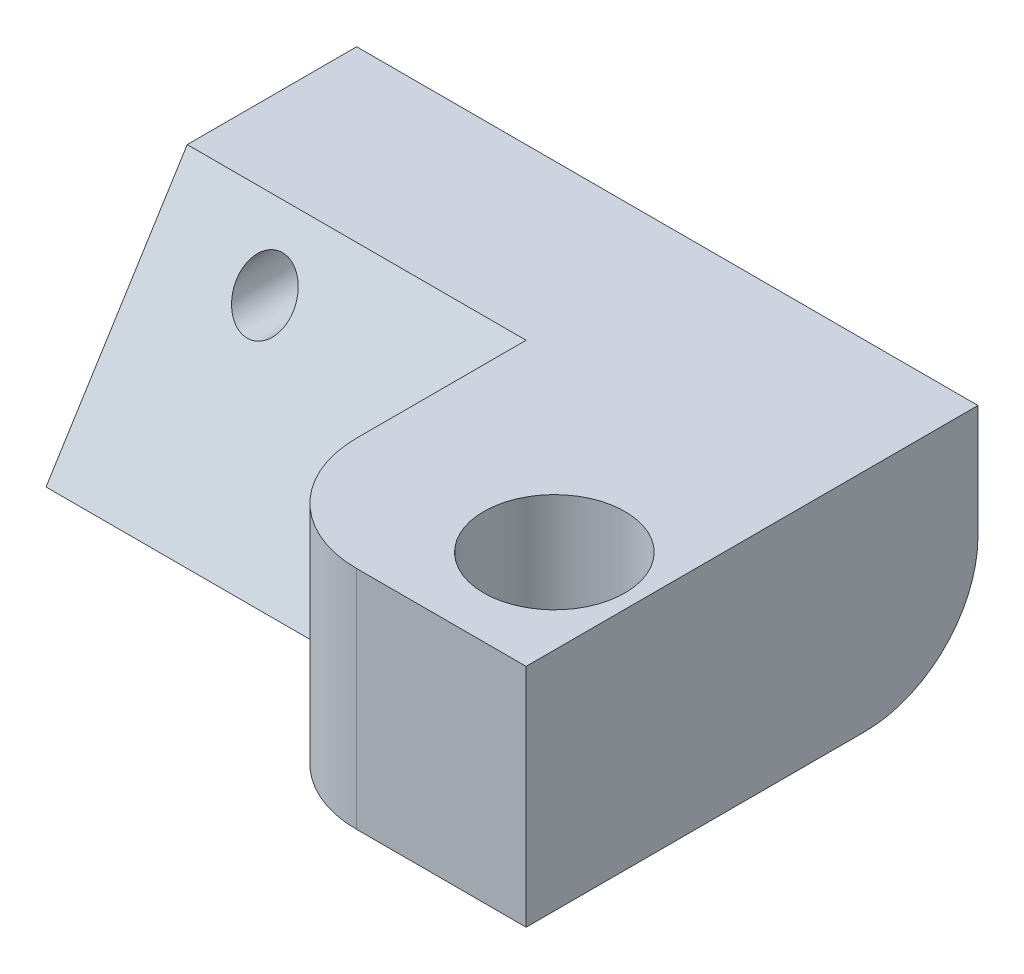
ISO-10303-21;
HEADER;
FILE_DESCRIPTION(('STEP AP214'),'2;1');
FILE_NAME('part.step','',(''),(''),'','','');
FILE_SCHEMA(('AUTOMOTIVE_DESIGN { 1 0 10303 214 1 1 1 1 }'));
ENDSEC;
DATA;
#1=APPLICATION_CONTEXT('core data for automotive mechanical design processes');
#2=APPLICATION_PROTOCOL_DEFINITION('international standard','automotive_design',2000,#1);
#3=PRODUCT_CONTEXT('',#1,'mechanical');
#4=PRODUCT('Part','Part','',(#3));
#5=PRODUCT_RELATED_PRODUCT_CATEGORY('part','',(#4));
#6=PRODUCT_DEFINITION_FORMATION('','',#4);
#7=PRODUCT_DEFINITION_CONTEXT('part definition',#1,'design');
#8=PRODUCT_DEFINITION('design','',#6,#7);
#9=PRODUCT_DEFINITION_SHAPE('','',#8);
#10=(LENGTH_UNIT() NAMED_UNIT(*) SI_UNIT(.MILLI.,.METRE.));
#11=(NAMED_UNIT(*) PLANE_ANGLE_UNIT() SI_UNIT($,.RADIAN.));
#12=(NAMED_UNIT(*) SI_UNIT($,.STERADIAN.) SOLID_ANGLE_UNIT());
#13=UNCERTAINTY_MEASURE_WITH_UNIT(LENGTH_MEASURE(1.E-05),#10,'distance_accuracy_value','');
#14=(GEOMETRIC_REPRESENTATION_CONTEXT(3) GLOBAL_UNCERTAINTY_ASSIGNED_CONTEXT((#13)) GLOBAL_UNIT_ASSIGNED_CONTEXT((#10,
#11,#12)) REPRESENTATION_CONTEXT('',''));
#15=CARTESIAN_POINT('',(0.,0.,0.));
#16=DIRECTION('',(0.,0.,1.));
#17=DIRECTION('',(1.,0.,0.));
#18=AXIS2_PLACEMENT_3D('',#15,#16,#17);
#19=CARTESIAN_POINT('',(120.65,-25.4,76.2));
#20=DIRECTION('',(0.,1.,0.));
#21=DIRECTION('',(0.,0.,1.));
#22=AXIS2_PLACEMENT_3D('',#19,#20,#21);
#23=CYLINDRICAL_SURFACE('',#22,9.52499999999998);
#24=CARTESIAN_POINT('',(120.65,0.,76.2));
#25=DIRECTION('',(0.,-1.,0.));
#26=DIRECTION('',(0.,0.,-1.));
#27=AXIS2_PLACEMENT_3D('',#24,#25,#26);
#28=CIRCLE('',#27,9.52499999999998);
#29=CARTESIAN_POINT('',(120.65,0.,85.725));
#30=VERTEX_POINT('',#29);
#31=EDGE_CURVE('E153',#30,#30,#28,.T.);
#32=CARTESIAN_POINT('',(120.65,25.4,76.2));
#33=DIRECTION('',(0.,1.,0.));
#34=DIRECTION('',(0.,0.,1.));
#35=AXIS2_PLACEMENT_3D('',#32,#33,#34);
#36=CIRCLE('',#35,9.52499999999998);
#37=CARTESIAN_POINT('',(120.65,25.4,85.725));
#38=VERTEX_POINT('',#37);
#39=EDGE_CURVE('E156',#38,#38,#36,.F.);
#40=CARTESIAN_POINT('',(120.65,0.,85.725));
#41=CARTESIAN_POINT('',(120.65,0.264583333333337,85.725));
#42=CARTESIAN_POINT('',(120.65,0.52916666666667,85.725));
#43=CARTESIAN_POINT('',(120.65,1.05833333333334,85.725));
#44=CARTESIAN_POINT('',(120.65,1.32291666666667,85.725));
#45=CARTESIAN_POINT('',(120.65,1.85208333333334,85.725));
#46=CARTESIAN_POINT('',(120.65,2.11666666666667,85.725));
#47=CARTESIAN_POINT('',(120.65,2.64583333333334,85.725));
#48=CARTESIAN_POINT('',(120.65,2.91041666666667,85.725));
#49=CARTESIAN_POINT('',(120.65,3.43958333333334,85.725));
#50=CARTESIAN_POINT('',(120.65,3.70416666666667,85.725));
#51=CARTESIAN_POINT('',(120.65,4.23333333333334,85.725));
#52=CARTESIAN_POINT('',(120.65,4.49791666666667,85.725));
#53=CARTESIAN_POINT('',(120.65,5.02708333333334,85.725));
#54=CARTESIAN_POINT('',(120.65,5.29166666666667,85.725));
#55=CARTESIAN_POINT('',(120.65,5.82083333333333,85.725));
#56=CARTESIAN_POINT('',(120.65,6.08541666666667,85.725));
#57=CARTESIAN_POINT('',(120.65,6.61458333333333,85.725));
#58=CARTESIAN_POINT('',(120.65,6.87916666666667,85.725));
#59=CARTESIAN_POINT('',(120.65,7.40833333333333,85.725));
#60=CARTESIAN_POINT('',(120.65,7.67291666666667,85.725));
#61=CARTESIAN_POINT('',(120.65,8.20208333333333,85.725));
#62=CARTESIAN_POINT('',(120.65,8.46666666666667,85.725));
#63=CARTESIAN_POINT('',(120.65,8.99583333333334,85.725));
#64=CARTESIAN_POINT('',(120.65,9.26041666666667,85.725));
#65=CARTESIAN_POINT('',(120.65,9.78958333333333,85.725));
#66=CARTESIAN_POINT('',(120.65,10.0541666666667,85.725));
#67=CARTESIAN_POINT('',(120.65,10.5833333333333,85.725));
#68=CARTESIAN_POINT('',(120.65,10.8479166666667,85.725));
#69=CARTESIAN_POINT('',(120.65,11.3770833333333,85.725));
#70=CARTESIAN_POINT('',(120.65,11.6416666666667,85.725));
#71=CARTESIAN_POINT('',(120.65,12.1708333333333,85.725));
#72=CARTESIAN_POINT('',(120.65,12.4354166666667,85.725));
#73=CARTESIAN_POINT('',(120.65,12.9645833333333,85.725));
#74=CARTESIAN_POINT('',(120.65,13.2291666666667,85.725));
#75=CARTESIAN_POINT('',(120.65,13.7583333333333,85.725));
#76=CARTESIAN_POINT('',(120.65,14.0229166666667,85.725));
#77=CARTESIAN_POINT('',(120.65,14.5520833333333,85.725));
#78=CARTESIAN_POINT('',(120.65,14.8166666666667,85.725));
#79=CARTESIAN_POINT('',(120.65,15.3458333333333,85.725));
#80=CARTESIAN_POINT('',(120.65,15.6104166666667,85.725));
#81=CARTESIAN_POINT('',(120.65,16.1395833333333,85.725));
#82=CARTESIAN_POINT('',(120.65,16.4041666666667,85.725));
#83=CARTESIAN_POINT('',(120.65,16.9333333333333,85.725));
#84=CARTESIAN_POINT('',(120.65,17.1979166666667,85.725));
#85=CARTESIAN_POINT('',(120.65,17.7270833333333,85.725));
#86=CARTESIAN_POINT('',(120.65,17.9916666666667,85.725));
#87=CARTESIAN_POINT('',(120.65,18.5208333333333,85.725));
#88=CARTESIAN_POINT('',(120.65,18.7854166666667,85.725));
#89=CARTESIAN_POINT('',(120.65,19.3145833333333,85.725));
#90=CARTESIAN_POINT('',(120.65,19.5791666666667,85.725));
#91=CARTESIAN_POINT('',(120.65,20.1083333333333,85.725));
#92=CARTESIAN_POINT('',(120.65,20.3729166666667,85.725));
#93=CARTESIAN_POINT('',(120.65,20.9020833333333,85.725));
#94=CARTESIAN_POINT('',(120.65,21.1666666666667,85.725));
#95=CARTESIAN_POINT('',(120.65,21.6958333333333,85.725));
#96=CARTESIAN_POINT('',(120.65,21.9604166666667,85.725));
#97=CARTESIAN_POINT('',(120.65,22.4895833333333,85.725));
#98=CARTESIAN_POINT('',(120.65,22.7541666666667,85.725));
#99=CARTESIAN_POINT('',(120.65,23.2833333333333,85.725));
#100=CARTESIAN_POINT('',(120.65,23.5479166666667,85.725));
#101=CARTESIAN_POINT('',(120.65,24.0770833333333,85.725));
#102=CARTESIAN_POINT('',(120.65,24.3416666666667,85.725));
#103=CARTESIAN_POINT('',(120.65,24.8708333333333,85.725));
#104=CARTESIAN_POINT('',(120.65,25.1354166666667,85.725));
#105=CARTESIAN_POINT('',(120.65,25.4,85.725));
#106=B_SPLINE_CURVE_WITH_KNOTS('',3,(#40,#41,#42,#43,#44,#45,#46,#47,#48,#49,#50,#51,#52,#53,
#54,#55,#56,#57,#58,#59,#60,#61,#62,#63,#64,#65,#66,#67,#68,#69,#70,#71,#72,#73,#74,#75,#76,#77,
#78,#79,#80,#81,#82,#83,#84,#85,#86,#87,#88,#89,#90,#91,#92,#93,#94,#95,#96,#97,#98,#99,#100,
#101,#102,#103,#104,#105),.UNSPECIFIED.,.F.,.F.,(4,2,2,2,2,2,2,2,2,2,2,2,2,2,2,2,2,2,2,2,2,2,2,
2,2,2,2,2,2,2,2,2,4),(0.,0.793749999999999,1.5875,2.38125,3.175,3.96875,4.7625,5.55625,6.35,
7.14374999999999,7.9375,8.73125,9.525,10.31875,11.1125,11.90625,12.7,13.49375,14.2875,15.08125,
15.875,16.66875,17.4625,18.25625,19.05,19.84375,20.6375,21.43125,22.225,23.01875,23.8125,
24.60625,25.4),.UNSPECIFIED.);
#107=EDGE_CURVE('BSEAM33',#30,#38,#106,.T.);
#108=ORIENTED_EDGE('',*,*,#31,.T.);
#109=ORIENTED_EDGE('',*,*,#39,.F.);
#110=ORIENTED_EDGE('',*,*,#107,.T.);
#111=ORIENTED_EDGE('',*,*,#107,.F.);
#112=EDGE_LOOP('',(#108,#110,#109,#111));
#113=FACE_BOUND('',#112,.T.);
#114=ADVANCED_FACE('F33',(#113),#23,.F.);
#115=CARTESIAN_POINT('',(139.7,50.8,101.6));
#116=DIRECTION('',(0.,0.,-1.));
#117=DIRECTION('',(-1.,0.,0.));
#118=AXIS2_PLACEMENT_3D('',#115,#116,#117);
#119=PLANE('',#118);
#120=DIRECTION('',(1.,0.,0.));
#121=VECTOR('',#120,1.);
#122=CARTESIAN_POINT('',(76.2,50.8,101.6));
#123=LINE('',#122,#121);
#124=CARTESIAN_POINT('',(101.6,50.8,101.6));
#125=VERTEX_POINT('',#124);
#126=CARTESIAN_POINT('',(139.7,50.8,101.6));
#127=VERTEX_POINT('',#126);
#128=EDGE_CURVE('E132',#125,#127,#123,.T.);
#129=ORIENTED_EDGE('',*,*,#128,.F.);
#130=DIRECTION('',(0.,1.,0.));
#131=VECTOR('',#130,1.);
#132=CARTESIAN_POINT('',(101.6,0.,101.6));
#133=LINE('',#132,#131);
#134=CARTESIAN_POINT('',(101.6,0.,101.6));
#135=VERTEX_POINT('',#134);
#136=EDGE_CURVE('E163',#125,#135,#133,.F.);
#137=ORIENTED_EDGE('',*,*,#136,.T.);
#138=DIRECTION('',(1.,0.,0.));
#139=VECTOR('',#138,1.);
#140=CARTESIAN_POINT('',(139.7,0.,101.6));
#141=LINE('',#140,#139);
#142=CARTESIAN_POINT('',(139.7,0.,101.6));
#143=VERTEX_POINT('',#142);
#144=EDGE_CURVE('E126',#135,#143,#141,.T.);
#145=ORIENTED_EDGE('',*,*,#144,.T.);
#146=DIRECTION('',(0.,-1.,0.));
#147=VECTOR('',#146,1.);
#148=CARTESIAN_POINT('',(139.7,50.8,101.6));
#149=LINE('',#148,#147);
#150=EDGE_CURVE('E146',#127,#143,#149,.T.);
#151=ORIENTED_EDGE('',*,*,#150,.F.);
#152=EDGE_LOOP('',(#129,#137,#145,#151));
#153=FACE_BOUND('',#152,.T.);
#154=ADVANCED_FACE('F187',(#153),#119,.F.);
#155=CARTESIAN_POINT('',(0.,50.8,101.6));
#156=DIRECTION('',(1.,0.,0.));
#157=DIRECTION('',(0.,0.,-1.));
#158=AXIS2_PLACEMENT_3D('',#155,#156,#157);
#159=PLANE('',#158);
#160=DIRECTION('',(0.,-1.,0.));
#161=VECTOR('',#160,1.);
#162=CARTESIAN_POINT('',(0.,50.8,0.));
#163=LINE('',#162,#161);
#164=CARTESIAN_POINT('',(0.,50.8,0.));
#165=VERTEX_POINT('',#164);
#166=CARTESIAN_POINT('',(0.,25.4,0.));
#167=VERTEX_POINT('',#166);
#168=EDGE_CURVE('E138',#165,#167,#163,.T.);
#169=ORIENTED_EDGE('',*,*,#168,.T.);
#170=CARTESIAN_POINT('',(0.,25.4,25.4));
#171=DIRECTION('',(1.,0.,0.));
#172=DIRECTION('',(0.,0.,-1.));
#173=AXIS2_PLACEMENT_3D('',#170,#171,#172);
#174=CIRCLE('',#173,25.4);
#175=CARTESIAN_POINT('',(0.,0.,25.4));
#176=VERTEX_POINT('',#175);
#177=EDGE_CURVE('E41',#167,#176,#174,.F.);
#178=ORIENTED_EDGE('',*,*,#177,.T.);
#179=DIRECTION('',(0.,0.,1.));
#180=VECTOR('',#179,1.);
#181=CARTESIAN_POINT('',(0.,0.,101.6));
#182=LINE('',#181,#180);
#183=CARTESIAN_POINT('',(0.,0.,69.85));
#184=VERTEX_POINT('',#183);
#185=EDGE_CURVE('E124',#176,#184,#182,.T.);
#186=ORIENTED_EDGE('',*,*,#185,.T.);
#187=DIRECTION('',(0.,-0.847998304005088,0.52999894000318));
#188=VECTOR('',#187,1.);
#189=CARTESIAN_POINT('',(0.,0.,69.85));
#190=LINE('',#189,#188);
#191=CARTESIAN_POINT('',(0.,50.8,38.1));
#192=VERTEX_POINT('',#191);
#193=EDGE_CURVE('E118',#192,#184,#190,.T.);
#194=ORIENTED_EDGE('',*,*,#193,.F.);
#195=DIRECTION('',(0.,0.,1.));
#196=VECTOR('',#195,1.);
#197=CARTESIAN_POINT('',(0.,50.8,0.));
#198=LINE('',#197,#196);
#199=EDGE_CURVE('E123',#165,#192,#198,.T.);
#200=ORIENTED_EDGE('',*,*,#199,.F.);
#201=EDGE_LOOP('',(#169,#178,#186,#194,#200));
#202=FACE_BOUND('',#201,.T.);
#203=ADVANCED_FACE('F172',(#202),#159,.F.);
#204=CARTESIAN_POINT('',(139.7,50.8,0.));
#205=DIRECTION('',(-1.,0.,0.));
#206=DIRECTION('',(0.,0.,1.));
#207=AXIS2_PLACEMENT_3D('',#204,#205,#206);
#208=PLANE('',#207);
#209=DIRECTION('',(0.,0.,-1.));
#210=VECTOR('',#209,1.);
#211=CARTESIAN_POINT('',(139.7,0.,0.));
#212=LINE('',#211,#210);
#213=CARTESIAN_POINT('',(139.7,0.,25.4));
#214=VERTEX_POINT('',#213);
#215=EDGE_CURVE('E133',#143,#214,#212,.T.);
#216=ORIENTED_EDGE('',*,*,#215,.T.);
#217=CARTESIAN_POINT('',(139.7,25.4,25.4));
#218=DIRECTION('',(-1.,0.,0.));
#219=DIRECTION('',(0.,0.,1.));
#220=AXIS2_PLACEMENT_3D('',#217,#218,#219);
#221=CIRCLE('',#220,25.4);
#222=CARTESIAN_POINT('',(139.7,25.4,0.));
#223=VERTEX_POINT('',#222);
#224=EDGE_CURVE('E11',#214,#223,#221,.F.);
#225=ORIENTED_EDGE('',*,*,#224,.T.);
#226=DIRECTION('',(0.,-1.,0.));
#227=VECTOR('',#226,1.);
#228=CARTESIAN_POINT('',(139.7,50.8,0.));
#229=LINE('',#228,#227);
#230=CARTESIAN_POINT('',(139.7,50.8,0.));
#231=VERTEX_POINT('',#230);
#232=EDGE_CURVE('E144',#231,#223,#229,.T.);
#233=ORIENTED_EDGE('',*,*,#232,.F.);
#234=DIRECTION('',(0.,0.,-1.));
#235=VECTOR('',#234,1.);
#236=CARTESIAN_POINT('',(139.7,50.8,28.8212951331257));
#237=LINE('',#236,#235);
#238=EDGE_CURVE('E135',#127,#231,#237,.T.);
#239=ORIENTED_EDGE('',*,*,#238,.F.);
#240=ORIENTED_EDGE('',*,*,#150,.T.);
#241=EDGE_LOOP('',(#216,#225,#233,#239,#240));
#242=FACE_BOUND('',#241,.T.);
#243=ADVANCED_FACE('F182',(#242),#208,.F.);
#244=CARTESIAN_POINT('',(0.,50.8,0.));
#245=DIRECTION('',(0.,0.,1.));
#246=DIRECTION('',(1.,0.,0.));
#247=AXIS2_PLACEMENT_3D('',#244,#245,#246);
#248=PLANE('',#247);
#249=CARTESIAN_POINT('',(25.4,38.1,0.));
#250=DIRECTION('',(0.,0.,-1.));
#251=DIRECTION('',(-1.,0.,0.));
#252=AXIS2_PLACEMENT_3D('',#249,#250,#251);
#253=CIRCLE('',#252,6.35);
#254=CARTESIAN_POINT('',(19.05,38.1,0.));
#255=VERTEX_POINT('',#254);
#256=EDGE_CURVE('E152',#255,#255,#253,.T.);
#257=ORIENTED_EDGE('',*,*,#256,.F.);
#258=EDGE_LOOP('',(#257));
#259=FACE_BOUND('',#258,.T.);
#260=ORIENTED_EDGE('',*,*,#232,.T.);
#261=DIRECTION('',(-1.,0.,0.));
#262=VECTOR('',#261,1.);
#263=CARTESIAN_POINT('',(0.,25.4,0.));
#264=LINE('',#263,#262);
#265=EDGE_CURVE('E169',#223,#167,#264,.T.);
#266=ORIENTED_EDGE('',*,*,#265,.T.);
#267=ORIENTED_EDGE('',*,*,#168,.F.);
#268=DIRECTION('',(-1.,0.,0.));
#269=VECTOR('',#268,1.);
#270=CARTESIAN_POINT('',(0.,50.8,0.));
#271=LINE('',#270,#269);
#272=EDGE_CURVE('E137',#231,#165,#271,.T.);
#273=ORIENTED_EDGE('',*,*,#272,.F.);
#274=EDGE_LOOP('',(#260,#266,#267,#273));
#275=FACE_BOUND('',#274,.T.);
#276=ADVANCED_FACE('F179',(#259,#275),#248,.F.);
#277=CARTESIAN_POINT('',(0.,50.8,0.));
#278=DIRECTION('',(0.,-1.,0.));
#279=DIRECTION('',(0.,0.,-1.));
#280=AXIS2_PLACEMENT_3D('',#277,#278,#279);
#281=PLANE('',#280);
#282=CARTESIAN_POINT('',(120.65,50.8,76.2));
#283=DIRECTION('',(0.,1.,0.));
#284=DIRECTION('',(0.,0.,1.));
#285=AXIS2_PLACEMENT_3D('',#282,#283,#284);
#286=CIRCLE('',#285,15.875);
#287=CARTESIAN_POINT('',(120.65,50.8,92.075));
#288=VERTEX_POINT('',#287);
#289=EDGE_CURVE('E326',#288,#288,#286,.T.);
#290=ORIENTED_EDGE('',*,*,#289,.F.);
#291=EDGE_LOOP('',(#290));
#292=FACE_BOUND('',#291,.T.);
#293=DIRECTION('',(0.,0.,-1.));
#294=VECTOR('',#293,1.);
#295=CARTESIAN_POINT('',(76.2,50.8,101.6));
#296=LINE('',#295,#294);
#297=CARTESIAN_POINT('',(76.2,50.8,76.2));
#298=VERTEX_POINT('',#297);
#299=CARTESIAN_POINT('',(76.2,50.8,38.1));
#300=VERTEX_POINT('',#299);
#301=EDGE_CURVE('E98',#298,#300,#296,.T.);
#302=ORIENTED_EDGE('',*,*,#301,.F.);
#303=CARTESIAN_POINT('',(101.6,50.8,76.2));
#304=DIRECTION('',(0.,-1.,0.));
#305=DIRECTION('',(0.,0.,-1.));
#306=AXIS2_PLACEMENT_3D('',#303,#304,#305);
#307=CIRCLE('',#306,25.4);
#308=EDGE_CURVE('E161',#298,#125,#307,.F.);
#309=ORIENTED_EDGE('',*,*,#308,.T.);
#310=ORIENTED_EDGE('',*,*,#128,.T.);
#311=ORIENTED_EDGE('',*,*,#238,.T.);
#312=ORIENTED_EDGE('',*,*,#272,.T.);
#313=ORIENTED_EDGE('',*,*,#199,.T.);
#314=DIRECTION('',(-1.,0.,0.));
#315=VECTOR('',#314,1.);
#316=CARTESIAN_POINT('',(76.2,50.8,38.1));
#317=LINE('',#316,#315);
#318=EDGE_CURVE('E114',#300,#192,#317,.T.);
#319=ORIENTED_EDGE('',*,*,#318,.F.);
#320=EDGE_LOOP('',(#302,#309,#310,#311,#312,#313,#319));
#321=FACE_BOUND('',#320,.T.);
#322=ADVANCED_FACE('F121',(#292,#321),#281,.F.);
#323=CARTESIAN_POINT('',(0.,0.,0.));
#324=DIRECTION('',(0.,-1.,0.));
#325=DIRECTION('',(0.,0.,-1.));
#326=AXIS2_PLACEMENT_3D('',#323,#324,#325);
#327=PLANE('',#326);
#328=ORIENTED_EDGE('',*,*,#31,.F.);
#329=EDGE_LOOP('',(#328));
#330=FACE_BOUND('',#329,.T.);
#331=ORIENTED_EDGE('',*,*,#144,.F.);
#332=CARTESIAN_POINT('',(101.6,0.,76.2));
#333=DIRECTION('',(0.,-1.,0.));
#334=DIRECTION('',(0.,0.,-1.));
#335=AXIS2_PLACEMENT_3D('',#332,#333,#334);
#336=CIRCLE('',#335,25.4);
#337=CARTESIAN_POINT('',(76.2,0.,76.2));
#338=VERTEX_POINT('',#337);
#339=EDGE_CURVE('E167',#135,#338,#336,.T.);
#340=ORIENTED_EDGE('',*,*,#339,.T.);
#341=DIRECTION('',(0.,0.,1.));
#342=VECTOR('',#341,1.);
#343=CARTESIAN_POINT('',(76.2,0.,69.85));
#344=LINE('',#343,#342);
#345=CARTESIAN_POINT('',(76.2,0.,69.85));
#346=VERTEX_POINT('',#345);
#347=EDGE_CURVE('E109',#346,#338,#344,.T.);
#348=ORIENTED_EDGE('',*,*,#347,.F.);
#349=DIRECTION('',(-1.,0.,0.));
#350=VECTOR('',#349,1.);
#351=CARTESIAN_POINT('',(76.2,0.,69.85));
#352=LINE('',#351,#350);
#353=EDGE_CURVE('E108',#346,#184,#352,.T.);
#354=ORIENTED_EDGE('',*,*,#353,.T.);
#355=ORIENTED_EDGE('',*,*,#185,.F.);
#356=DIRECTION('',(-1.,0.,0.));
#357=VECTOR('',#356,1.);
#358=CARTESIAN_POINT('',(139.7,0.,25.4));
#359=LINE('',#358,#357);
#360=EDGE_CURVE('E165',#176,#214,#359,.F.);
#361=ORIENTED_EDGE('',*,*,#360,.T.);
#362=ORIENTED_EDGE('',*,*,#215,.F.);
#363=EDGE_LOOP('',(#331,#340,#348,#354,#355,#361,#362));
#364=FACE_BOUND('',#363,.T.);
#365=ADVANCED_FACE('F176',(#330,#364),#327,.T.);
#366=CARTESIAN_POINT('',(76.2,0.,69.85));
#367=DIRECTION('',(0.,-0.52999894000318,-0.847998304005088));
#368=DIRECTION('',(0.,0.847998304005088,-0.52999894000318));
#369=AXIS2_PLACEMENT_3D('',#366,#367,#368);
#370=PLANE('',#369);
#371=CARTESIAN_POINT('',(25.4,38.1,46.0375));
#372=DIRECTION('',(0.,-0.52999894000318,-0.847998304005088));
#373=DIRECTION('',(0.,0.847998304005088,-0.52999894000318));
#374=AXIS2_PLACEMENT_3D('',#371,#372,#373);
#375=ELLIPSE('',#374,7.48822252356993,6.35);
#376=CARTESIAN_POINT('',(25.4,44.45,42.06875));
#377=VERTEX_POINT('',#376);
#378=EDGE_CURVE('E149',#377,#377,#375,.T.);
#379=ORIENTED_EDGE('',*,*,#378,.T.);
#380=EDGE_LOOP('',(#379));
#381=FACE_BOUND('',#380,.T.);
#382=ORIENTED_EDGE('',*,*,#193,.T.);
#383=ORIENTED_EDGE('',*,*,#353,.F.);
#384=DIRECTION('',(0.,-0.847998304005088,0.52999894000318));
#385=VECTOR('',#384,1.);
#386=CARTESIAN_POINT('',(76.2,0.,69.85));
#387=LINE('',#386,#385);
#388=EDGE_CURVE('E102',#300,#346,#387,.T.);
#389=ORIENTED_EDGE('',*,*,#388,.F.);
#390=ORIENTED_EDGE('',*,*,#318,.T.);
#391=EDGE_LOOP('',(#382,#383,#389,#390));
#392=FACE_BOUND('',#391,.T.);
#393=ADVANCED_FACE('F113',(#381,#392),#370,.F.);
#394=CARTESIAN_POINT('',(76.2,0.,0.));
#395=DIRECTION('',(-1.,0.,0.));
#396=DIRECTION('',(0.,0.,1.));
#397=AXIS2_PLACEMENT_3D('',#394,#395,#396);
#398=PLANE('',#397);
#399=ORIENTED_EDGE('',*,*,#347,.T.);
#400=DIRECTION('',(0.,1.,0.));
#401=VECTOR('',#400,1.);
#402=CARTESIAN_POINT('',(76.2,50.8,76.2));
#403=LINE('',#402,#401);
#404=EDGE_CURVE('E105',#338,#298,#403,.T.);
#405=ORIENTED_EDGE('',*,*,#404,.T.);
#406=ORIENTED_EDGE('',*,*,#301,.T.);
#407=ORIENTED_EDGE('',*,*,#388,.T.);
#408=EDGE_LOOP('',(#399,#405,#406,#407));
#409=FACE_BOUND('',#408,.T.);
#410=ADVANCED_FACE('F101',(#409),#398,.T.);
#411=CARTESIAN_POINT('',(25.4,38.1,76.2));
#412=DIRECTION('',(0.,0.,-1.));
#413=DIRECTION('',(-1.,0.,0.));
#414=AXIS2_PLACEMENT_3D('',#411,#412,#413);
#415=CYLINDRICAL_SURFACE('',#414,6.35);
#416=ORIENTED_EDGE('',*,*,#256,.T.);
#417=EDGE_LOOP('',(#416));
#418=FACE_BOUND('',#417,.T.);
#419=ORIENTED_EDGE('',*,*,#378,.F.);
#420=EDGE_LOOP('',(#419));
#421=FACE_BOUND('',#420,.T.);
#422=ADVANCED_FACE('F212',(#418,#421),#415,.F.);
#423=CARTESIAN_POINT('',(120.65,25.4,76.2));
#424=DIRECTION('',(0.,1.,0.));
#425=DIRECTION('',(0.,0.,1.));
#426=AXIS2_PLACEMENT_3D('',#423,#424,#425);
#427=PLANE('',#426);
#428=CARTESIAN_POINT('',(120.65,25.4,76.2));
#429=DIRECTION('',(0.,1.,0.));
#430=DIRECTION('',(0.,0.,1.));
#431=AXIS2_PLACEMENT_3D('',#428,#429,#430);
#432=CIRCLE('',#431,15.875);
#433=CARTESIAN_POINT('',(120.65,25.4,92.075));
#434=VERTEX_POINT('',#433);
#435=EDGE_CURVE('E159',#434,#434,#432,.T.);
#436=ORIENTED_EDGE('',*,*,#435,.T.);
#437=EDGE_LOOP('',(#436));
#438=FACE_BOUND('',#437,.T.);
#439=ORIENTED_EDGE('',*,*,#39,.T.);
#440=EDGE_LOOP('',(#439));
#441=FACE_BOUND('',#440,.T.);
#442=ADVANCED_FACE('F197',(#438,#441),#427,.T.);
#443=CARTESIAN_POINT('',(120.65,25.4,76.2));
#444=DIRECTION('',(0.,1.,0.));
#445=DIRECTION('',(0.,0.,1.));
#446=AXIS2_PLACEMENT_3D('',#443,#444,#445);
#447=CYLINDRICAL_SURFACE('',#446,15.875);
#448=ORIENTED_EDGE('',*,*,#435,.F.);
#449=EDGE_LOOP('',(#448));
#450=FACE_BOUND('',#449,.T.);
#451=ORIENTED_EDGE('',*,*,#289,.T.);
#452=EDGE_LOOP('',(#451));
#453=FACE_BOUND('',#452,.T.);
#454=ADVANCED_FACE('F192',(#450,#453),#447,.F.);
#455=CARTESIAN_POINT('',(101.6,0.,76.2));
#456=DIRECTION('',(0.,-1.,0.));
#457=DIRECTION('',(1.,0.,0.));
#458=AXIS2_PLACEMENT_3D('',#455,#456,#457);
#459=CYLINDRICAL_SURFACE('',#458,25.4);
#460=ORIENTED_EDGE('',*,*,#339,.F.);
#461=ORIENTED_EDGE('',*,*,#136,.F.);
#462=ORIENTED_EDGE('',*,*,#308,.F.);
#463=ORIENTED_EDGE('',*,*,#404,.F.);
#464=EDGE_LOOP('',(#460,#461,#462,#463));
#465=FACE_BOUND('',#464,.T.);
#466=ADVANCED_FACE('F190',(#465),#459,.T.);
#467=CARTESIAN_POINT('',(0.,25.4,25.4));
#468=DIRECTION('',(1.,0.,0.));
#469=DIRECTION('',(0.,0.,-1.));
#470=AXIS2_PLACEMENT_3D('',#467,#468,#469);
#471=CYLINDRICAL_SURFACE('',#470,25.4);
#472=ORIENTED_EDGE('',*,*,#224,.F.);
#473=ORIENTED_EDGE('',*,*,#360,.F.);
#474=ORIENTED_EDGE('',*,*,#177,.F.);
#475=ORIENTED_EDGE('',*,*,#265,.F.);
#476=EDGE_LOOP('',(#472,#473,#474,#475));
#477=FACE_BOUND('',#476,.T.);
#478=ADVANCED_FACE('F35',(#477),#471,.T.);
#479=CLOSED_SHELL('',(#114,#154,#203,#243,#276,#322,#365,#393,#410,#422,#442,#454,#466,#478));
#480=MANIFOLD_SOLID_BREP('B2',#479);
#481=ADVANCED_BREP_SHAPE_REPRESENTATION('',(#18,#480),#14);
#482=SHAPE_DEFINITION_REPRESENTATION(#9,#481);
ENDSEC;
END-ISO-10303-21;
